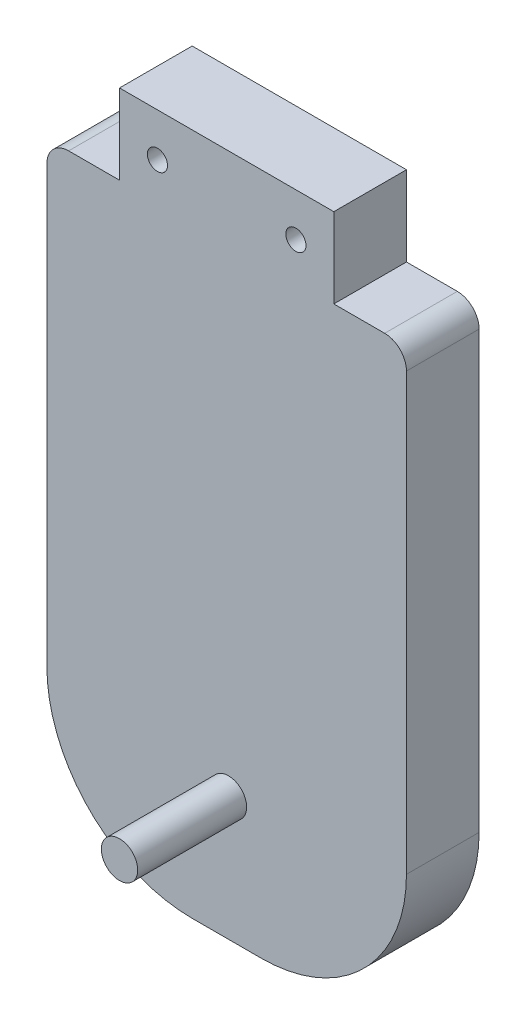
ISO-10303-21;
HEADER;
FILE_DESCRIPTION(('STEP AP214'),'2;1');
FILE_NAME('part.step','',(''),(''),'','','');
FILE_SCHEMA(('AUTOMOTIVE_DESIGN { 1 0 10303 214 1 1 1 1 }'));
ENDSEC;
DATA;
#1=APPLICATION_CONTEXT('core data for automotive mechanical design processes');
#2=APPLICATION_PROTOCOL_DEFINITION('international standard','automotive_design',2000,#1);
#3=PRODUCT_CONTEXT('',#1,'mechanical');
#4=PRODUCT('Part','Part','',(#3));
#5=PRODUCT_RELATED_PRODUCT_CATEGORY('part','',(#4));
#6=PRODUCT_DEFINITION_FORMATION('','',#4);
#7=PRODUCT_DEFINITION_CONTEXT('part definition',#1,'design');
#8=PRODUCT_DEFINITION('design','',#6,#7);
#9=PRODUCT_DEFINITION_SHAPE('','',#8);
#10=(LENGTH_UNIT() NAMED_UNIT(*) SI_UNIT(.MILLI.,.METRE.));
#11=(NAMED_UNIT(*) PLANE_ANGLE_UNIT() SI_UNIT($,.RADIAN.));
#12=(NAMED_UNIT(*) SI_UNIT($,.STERADIAN.) SOLID_ANGLE_UNIT());
#13=UNCERTAINTY_MEASURE_WITH_UNIT(LENGTH_MEASURE(1.E-05),#10,'distance_accuracy_value','');
#14=(GEOMETRIC_REPRESENTATION_CONTEXT(3) GLOBAL_UNCERTAINTY_ASSIGNED_CONTEXT((#13)) GLOBAL_UNIT_ASSIGNED_CONTEXT((#10,
#11,#12)) REPRESENTATION_CONTEXT('',''));
#15=CARTESIAN_POINT('',(0.,0.,0.));
#16=DIRECTION('',(0.,0.,1.));
#17=DIRECTION('',(1.,0.,0.));
#18=AXIS2_PLACEMENT_3D('',#15,#16,#17);
#19=CARTESIAN_POINT('',(11.5756722266574,78.1811812764466,0.));
#20=DIRECTION('',(-1.,0.,0.));
#21=DIRECTION('',(0.,-1.,0.));
#22=AXIS2_PLACEMENT_3D('',#19,#20,#21);
#23=PLANE('',#22);
#24=DIRECTION('',(0.,-1.,0.));
#25=VECTOR('',#24,1.);
#26=CARTESIAN_POINT('',(11.5756722266574,78.1811812764466,10.));
#27=LINE('',#26,#25);
#28=CARTESIAN_POINT('',(11.5756722266574,78.1811812764466,10.));
#29=VERTEX_POINT('',#28);
#30=CARTESIAN_POINT('',(11.5756722266574,67.1811812764466,10.));
#31=VERTEX_POINT('',#30);
#32=EDGE_CURVE('E168',#29,#31,#27,.T.);
#33=ORIENTED_EDGE('',*,*,#32,.F.);
#34=DIRECTION('',(0.,0.,1.));
#35=VECTOR('',#34,1.);
#36=CARTESIAN_POINT('',(11.5756722266574,78.1811812764466,0.));
#37=LINE('',#36,#35);
#38=CARTESIAN_POINT('',(11.5756722266574,78.1811812764466,0.));
#39=VERTEX_POINT('',#38);
#40=EDGE_CURVE('E11',#39,#29,#37,.T.);
#41=ORIENTED_EDGE('',*,*,#40,.F.);
#42=DIRECTION('',(0.,-1.,0.));
#43=VECTOR('',#42,1.);
#44=CARTESIAN_POINT('',(11.5756722266574,78.1811812764466,0.));
#45=LINE('',#44,#43);
#46=CARTESIAN_POINT('',(11.5756722266574,67.1811812764466,0.));
#47=VERTEX_POINT('',#46);
#48=EDGE_CURVE('E213',#39,#47,#45,.T.);
#49=ORIENTED_EDGE('',*,*,#48,.T.);
#50=DIRECTION('',(0.,0.,1.));
#51=VECTOR('',#50,1.);
#52=CARTESIAN_POINT('',(11.5756722266574,67.1811812764466,0.));
#53=LINE('',#52,#51);
#54=EDGE_CURVE('E44',#47,#31,#53,.T.);
#55=ORIENTED_EDGE('',*,*,#54,.T.);
#56=EDGE_LOOP('',(#33,#41,#49,#55));
#57=FACE_BOUND('',#56,.T.);
#58=ADVANCED_FACE('F41',(#57),#23,.T.);
#59=CARTESIAN_POINT('',(41.0756722266575,78.1811812764467,0.));
#60=DIRECTION('',(0.,1.,0.));
#61=DIRECTION('',(-1.,0.,0.));
#62=AXIS2_PLACEMENT_3D('',#59,#60,#61);
#63=PLANE('',#62);
#64=DIRECTION('',(-1.,0.,0.));
#65=VECTOR('',#64,1.);
#66=CARTESIAN_POINT('',(41.0756722266575,78.1811812764467,10.));
#67=LINE('',#66,#65);
#68=CARTESIAN_POINT('',(41.0756722266575,78.1811812764467,10.));
#69=VERTEX_POINT('',#68);
#70=EDGE_CURVE('E210',#69,#29,#67,.T.);
#71=ORIENTED_EDGE('',*,*,#70,.F.);
#72=DIRECTION('',(0.,0.,1.));
#73=VECTOR('',#72,1.);
#74=CARTESIAN_POINT('',(41.0756722266575,78.1811812764467,0.));
#75=LINE('',#74,#73);
#76=CARTESIAN_POINT('',(41.0756722266575,78.1811812764467,0.));
#77=VERTEX_POINT('',#76);
#78=EDGE_CURVE('E51',#77,#69,#75,.T.);
#79=ORIENTED_EDGE('',*,*,#78,.F.);
#80=DIRECTION('',(-1.,0.,0.));
#81=VECTOR('',#80,1.);
#82=CARTESIAN_POINT('',(41.0756722266575,78.1811812764467,0.));
#83=LINE('',#82,#81);
#84=EDGE_CURVE('E154',#77,#39,#83,.T.);
#85=ORIENTED_EDGE('',*,*,#84,.T.);
#86=ORIENTED_EDGE('',*,*,#40,.T.);
#87=EDGE_LOOP('',(#71,#79,#85,#86));
#88=FACE_BOUND('',#87,.T.);
#89=ADVANCED_FACE('F243',(#88),#63,.T.);
#90=CARTESIAN_POINT('',(41.0756722266574,67.1811812764467,0.));
#91=DIRECTION('',(1.,0.,0.));
#92=DIRECTION('',(0.,1.,0.));
#93=AXIS2_PLACEMENT_3D('',#90,#91,#92);
#94=PLANE('',#93);
#95=DIRECTION('',(0.,1.,0.));
#96=VECTOR('',#95,1.);
#97=CARTESIAN_POINT('',(41.0756722266574,67.1811812764467,10.));
#98=LINE('',#97,#96);
#99=CARTESIAN_POINT('',(41.0756722266574,67.1811812764467,10.));
#100=VERTEX_POINT('',#99);
#101=EDGE_CURVE('E140',#100,#69,#98,.T.);
#102=ORIENTED_EDGE('',*,*,#101,.F.);
#103=DIRECTION('',(0.,0.,1.));
#104=VECTOR('',#103,1.);
#105=CARTESIAN_POINT('',(41.0756722266574,67.1811812764467,0.));
#106=LINE('',#105,#104);
#107=CARTESIAN_POINT('',(41.0756722266574,67.1811812764467,0.));
#108=VERTEX_POINT('',#107);
#109=EDGE_CURVE('E135',#108,#100,#106,.T.);
#110=ORIENTED_EDGE('',*,*,#109,.F.);
#111=DIRECTION('',(0.,1.,0.));
#112=VECTOR('',#111,1.);
#113=CARTESIAN_POINT('',(41.0756722266574,67.1811812764467,0.));
#114=LINE('',#113,#112);
#115=EDGE_CURVE('E138',#108,#77,#114,.T.);
#116=ORIENTED_EDGE('',*,*,#115,.T.);
#117=ORIENTED_EDGE('',*,*,#78,.T.);
#118=EDGE_LOOP('',(#102,#110,#116,#117));
#119=FACE_BOUND('',#118,.T.);
#120=ADVANCED_FACE('F137',(#119),#94,.T.);
#121=CARTESIAN_POINT('',(48.0756722266574,67.1811812764467,0.));
#122=DIRECTION('',(0.,1.,0.));
#123=DIRECTION('',(0.,0.,1.));
#124=AXIS2_PLACEMENT_3D('',#121,#122,#123);
#125=PLANE('',#124);
#126=DIRECTION('',(-1.,0.,0.));
#127=VECTOR('',#126,1.);
#128=CARTESIAN_POINT('',(48.0756722266574,67.1811812764467,10.));
#129=LINE('',#128,#127);
#130=CARTESIAN_POINT('',(48.0756722266574,67.1811812764467,10.));
#131=VERTEX_POINT('',#130);
#132=EDGE_CURVE('E205',#131,#100,#129,.T.);
#133=ORIENTED_EDGE('',*,*,#132,.F.);
#134=DIRECTION('',(0.,0.,1.));
#135=VECTOR('',#134,1.);
#136=CARTESIAN_POINT('',(48.0756722266574,67.1811812764467,0.));
#137=LINE('',#136,#135);
#138=CARTESIAN_POINT('',(48.0756722266574,67.1811812764467,0.));
#139=VERTEX_POINT('',#138);
#140=EDGE_CURVE('E146',#139,#131,#137,.T.);
#141=ORIENTED_EDGE('',*,*,#140,.F.);
#142=DIRECTION('',(-1.,0.,0.));
#143=VECTOR('',#142,1.);
#144=CARTESIAN_POINT('',(48.0756722266574,67.1811812764467,0.));
#145=LINE('',#144,#143);
#146=EDGE_CURVE('E152',#139,#108,#145,.T.);
#147=ORIENTED_EDGE('',*,*,#146,.T.);
#148=ORIENTED_EDGE('',*,*,#109,.T.);
#149=EDGE_LOOP('',(#133,#141,#147,#148));
#150=FACE_BOUND('',#149,.T.);
#151=ADVANCED_FACE('F157',(#150),#125,.T.);
#152=CARTESIAN_POINT('',(48.0756722266574,64.1811812764466,0.));
#153=DIRECTION('',(0.,0.,1.));
#154=DIRECTION('',(1.,0.,0.));
#155=AXIS2_PLACEMENT_3D('',#152,#153,#154);
#156=CYLINDRICAL_SURFACE('',#155,3.00000000000003);
#157=CARTESIAN_POINT('',(48.0756722266574,64.1811812764466,10.));
#158=DIRECTION('',(0.,0.,1.));
#159=DIRECTION('',(1.,0.,0.));
#160=AXIS2_PLACEMENT_3D('',#157,#158,#159);
#161=CIRCLE('',#160,3.00000000000003);
#162=CARTESIAN_POINT('',(51.0756722266575,64.1811812764466,10.));
#163=VERTEX_POINT('',#162);
#164=EDGE_CURVE('E201',#163,#131,#161,.T.);
#165=ORIENTED_EDGE('',*,*,#164,.F.);
#166=DIRECTION('',(0.,0.,1.));
#167=VECTOR('',#166,1.);
#168=CARTESIAN_POINT('',(51.0756722266575,64.1811812764466,0.));
#169=LINE('',#168,#167);
#170=CARTESIAN_POINT('',(51.0756722266575,64.1811812764466,0.));
#171=VERTEX_POINT('',#170);
#172=EDGE_CURVE('E219',#171,#163,#169,.T.);
#173=ORIENTED_EDGE('',*,*,#172,.F.);
#174=CARTESIAN_POINT('',(48.0756722266574,64.1811812764466,0.));
#175=DIRECTION('',(0.,0.,1.));
#176=DIRECTION('',(1.,0.,0.));
#177=AXIS2_PLACEMENT_3D('',#174,#175,#176);
#178=CIRCLE('',#177,3.00000000000003);
#179=EDGE_CURVE('E159',#171,#139,#178,.T.);
#180=ORIENTED_EDGE('',*,*,#179,.T.);
#181=ORIENTED_EDGE('',*,*,#140,.T.);
#182=EDGE_LOOP('',(#165,#173,#180,#181));
#183=FACE_BOUND('',#182,.T.);
#184=ADVANCED_FACE('F256',(#183),#156,.T.);
#185=CARTESIAN_POINT('',(51.0756722266575,4.18118127644664,0.));
#186=DIRECTION('',(1.,0.,0.));
#187=DIRECTION('',(0.,0.,-1.));
#188=AXIS2_PLACEMENT_3D('',#185,#186,#187);
#189=PLANE('',#188);
#190=DIRECTION('',(0.,1.,0.));
#191=VECTOR('',#190,1.);
#192=CARTESIAN_POINT('',(51.0756722266575,4.18118127644664,10.));
#193=LINE('',#192,#191);
#194=CARTESIAN_POINT('',(51.0756722266575,4.18118127644664,10.));
#195=VERTEX_POINT('',#194);
#196=EDGE_CURVE('E197',#195,#163,#193,.T.);
#197=ORIENTED_EDGE('',*,*,#196,.F.);
#198=DIRECTION('',(0.,0.,1.));
#199=VECTOR('',#198,1.);
#200=CARTESIAN_POINT('',(51.0756722266575,4.18118127644664,0.));
#201=LINE('',#200,#199);
#202=CARTESIAN_POINT('',(51.0756722266575,4.18118127644664,0.));
#203=VERTEX_POINT('',#202);
#204=EDGE_CURVE('E222',#203,#195,#201,.T.);
#205=ORIENTED_EDGE('',*,*,#204,.F.);
#206=DIRECTION('',(0.,1.,0.));
#207=VECTOR('',#206,1.);
#208=CARTESIAN_POINT('',(51.0756722266575,4.18118127644664,0.));
#209=LINE('',#208,#207);
#210=EDGE_CURVE('E162',#203,#171,#209,.T.);
#211=ORIENTED_EDGE('',*,*,#210,.T.);
#212=ORIENTED_EDGE('',*,*,#172,.T.);
#213=EDGE_LOOP('',(#197,#205,#211,#212));
#214=FACE_BOUND('',#213,.T.);
#215=ADVANCED_FACE('F259',(#214),#189,.T.);
#216=CARTESIAN_POINT('',(31.0756722266575,4.18118127644664,0.));
#217=DIRECTION('',(0.,0.,1.));
#218=DIRECTION('',(1.,0.,0.));
#219=AXIS2_PLACEMENT_3D('',#216,#217,#218);
#220=CYLINDRICAL_SURFACE('',#219,20.);
#221=CARTESIAN_POINT('',(31.0756722266575,4.18118127644664,10.));
#222=DIRECTION('',(0.,0.,1.));
#223=DIRECTION('',(1.,0.,0.));
#224=AXIS2_PLACEMENT_3D('',#221,#222,#223);
#225=CIRCLE('',#224,20.);
#226=CARTESIAN_POINT('',(31.0756722266575,-15.8188187235534,10.));
#227=VERTEX_POINT('',#226);
#228=EDGE_CURVE('E193',#227,#195,#225,.T.);
#229=ORIENTED_EDGE('',*,*,#228,.F.);
#230=DIRECTION('',(0.,0.,1.));
#231=VECTOR('',#230,1.);
#232=CARTESIAN_POINT('',(31.0756722266575,-15.8188187235534,0.));
#233=LINE('',#232,#231);
#234=CARTESIAN_POINT('',(31.0756722266575,-15.8188187235534,0.));
#235=VERTEX_POINT('',#234);
#236=EDGE_CURVE('E225',#235,#227,#233,.T.);
#237=ORIENTED_EDGE('',*,*,#236,.F.);
#238=CARTESIAN_POINT('',(31.0756722266575,4.18118127644664,0.));
#239=DIRECTION('',(0.,0.,1.));
#240=DIRECTION('',(1.,0.,0.));
#241=AXIS2_PLACEMENT_3D('',#238,#239,#240);
#242=CIRCLE('',#241,20.);
#243=EDGE_CURVE('E357',#235,#203,#242,.T.);
#244=ORIENTED_EDGE('',*,*,#243,.T.);
#245=ORIENTED_EDGE('',*,*,#204,.T.);
#246=EDGE_LOOP('',(#229,#237,#244,#245));
#247=FACE_BOUND('',#246,.T.);
#248=ADVANCED_FACE('F263',(#247),#220,.T.);
#249=CARTESIAN_POINT('',(21.5756722266574,-15.8188187235534,0.));
#250=DIRECTION('',(0.,-1.,0.));
#251=DIRECTION('',(0.,0.,-1.));
#252=AXIS2_PLACEMENT_3D('',#249,#250,#251);
#253=PLANE('',#252);
#254=DIRECTION('',(1.,0.,0.));
#255=VECTOR('',#254,1.);
#256=CARTESIAN_POINT('',(21.5756722266574,-15.8188187235534,10.));
#257=LINE('',#256,#255);
#258=CARTESIAN_POINT('',(21.5756722266574,-15.8188187235534,10.));
#259=VERTEX_POINT('',#258);
#260=EDGE_CURVE('E189',#259,#227,#257,.T.);
#261=ORIENTED_EDGE('',*,*,#260,.F.);
#262=DIRECTION('',(0.,0.,1.));
#263=VECTOR('',#262,1.);
#264=CARTESIAN_POINT('',(21.5756722266574,-15.8188187235534,0.));
#265=LINE('',#264,#263);
#266=CARTESIAN_POINT('',(21.5756722266574,-15.8188187235534,0.));
#267=VERTEX_POINT('',#266);
#268=EDGE_CURVE('E228',#267,#259,#265,.T.);
#269=ORIENTED_EDGE('',*,*,#268,.F.);
#270=DIRECTION('',(1.,0.,0.));
#271=VECTOR('',#270,1.);
#272=CARTESIAN_POINT('',(21.5756722266574,-15.8188187235534,0.));
#273=LINE('',#272,#271);
#274=EDGE_CURVE('E353',#267,#235,#273,.T.);
#275=ORIENTED_EDGE('',*,*,#274,.T.);
#276=ORIENTED_EDGE('',*,*,#236,.T.);
#277=EDGE_LOOP('',(#261,#269,#275,#276));
#278=FACE_BOUND('',#277,.T.);
#279=ADVANCED_FACE('F267',(#278),#253,.T.);
#280=CARTESIAN_POINT('',(21.5756722266574,4.18118127644664,0.));
#281=DIRECTION('',(0.,0.,1.));
#282=DIRECTION('',(1.,0.,0.));
#283=AXIS2_PLACEMENT_3D('',#280,#281,#282);
#284=CYLINDRICAL_SURFACE('',#283,20.);
#285=CARTESIAN_POINT('',(21.5756722266574,4.18118127644664,10.));
#286=DIRECTION('',(0.,0.,1.));
#287=DIRECTION('',(1.,0.,0.));
#288=AXIS2_PLACEMENT_3D('',#285,#286,#287);
#289=CIRCLE('',#288,20.);
#290=CARTESIAN_POINT('',(1.57567222665744,4.18118127644663,10.));
#291=VERTEX_POINT('',#290);
#292=EDGE_CURVE('E185',#291,#259,#289,.T.);
#293=ORIENTED_EDGE('',*,*,#292,.F.);
#294=DIRECTION('',(0.,0.,1.));
#295=VECTOR('',#294,1.);
#296=CARTESIAN_POINT('',(1.57567222665744,4.18118127644663,0.));
#297=LINE('',#296,#295);
#298=CARTESIAN_POINT('',(1.57567222665744,4.18118127644663,0.));
#299=VERTEX_POINT('',#298);
#300=EDGE_CURVE('E231',#299,#291,#297,.T.);
#301=ORIENTED_EDGE('',*,*,#300,.F.);
#302=CARTESIAN_POINT('',(21.5756722266574,4.18118127644664,0.));
#303=DIRECTION('',(0.,0.,1.));
#304=DIRECTION('',(1.,0.,0.));
#305=AXIS2_PLACEMENT_3D('',#302,#303,#304);
#306=CIRCLE('',#305,20.);
#307=EDGE_CURVE('E349',#299,#267,#306,.T.);
#308=ORIENTED_EDGE('',*,*,#307,.T.);
#309=ORIENTED_EDGE('',*,*,#268,.T.);
#310=EDGE_LOOP('',(#293,#301,#308,#309));
#311=FACE_BOUND('',#310,.T.);
#312=ADVANCED_FACE('F271',(#311),#284,.T.);
#313=CARTESIAN_POINT('',(1.57567222665744,64.1811812764466,0.));
#314=DIRECTION('',(-1.,0.,0.));
#315=DIRECTION('',(0.,0.,1.));
#316=AXIS2_PLACEMENT_3D('',#313,#314,#315);
#317=PLANE('',#316);
#318=DIRECTION('',(0.,-1.,0.));
#319=VECTOR('',#318,1.);
#320=CARTESIAN_POINT('',(1.57567222665744,64.1811812764466,10.));
#321=LINE('',#320,#319);
#322=CARTESIAN_POINT('',(1.57567222665744,64.1811812764466,10.));
#323=VERTEX_POINT('',#322);
#324=EDGE_CURVE('E181',#323,#291,#321,.T.);
#325=ORIENTED_EDGE('',*,*,#324,.F.);
#326=DIRECTION('',(0.,0.,1.));
#327=VECTOR('',#326,1.);
#328=CARTESIAN_POINT('',(1.57567222665744,64.1811812764466,0.));
#329=LINE('',#328,#327);
#330=CARTESIAN_POINT('',(1.57567222665744,64.1811812764466,0.));
#331=VERTEX_POINT('',#330);
#332=EDGE_CURVE('E234',#331,#323,#329,.T.);
#333=ORIENTED_EDGE('',*,*,#332,.F.);
#334=DIRECTION('',(0.,-1.,0.));
#335=VECTOR('',#334,1.);
#336=CARTESIAN_POINT('',(1.57567222665744,64.1811812764466,0.));
#337=LINE('',#336,#335);
#338=EDGE_CURVE('E345',#331,#299,#337,.T.);
#339=ORIENTED_EDGE('',*,*,#338,.T.);
#340=ORIENTED_EDGE('',*,*,#300,.T.);
#341=EDGE_LOOP('',(#325,#333,#339,#340));
#342=FACE_BOUND('',#341,.T.);
#343=ADVANCED_FACE('F275',(#342),#317,.T.);
#344=CARTESIAN_POINT('',(4.57567222665745,64.1811812764466,0.));
#345=DIRECTION('',(0.,0.,1.));
#346=DIRECTION('',(1.,0.,0.));
#347=AXIS2_PLACEMENT_3D('',#344,#345,#346);
#348=CYLINDRICAL_SURFACE('',#347,3.);
#349=CARTESIAN_POINT('',(4.57567222665745,64.1811812764466,10.));
#350=DIRECTION('',(0.,0.,1.));
#351=DIRECTION('',(1.,0.,0.));
#352=AXIS2_PLACEMENT_3D('',#349,#350,#351);
#353=CIRCLE('',#352,3.);
#354=CARTESIAN_POINT('',(4.57567222665745,67.1811812764466,10.));
#355=VERTEX_POINT('',#354);
#356=EDGE_CURVE('E177',#355,#323,#353,.T.);
#357=ORIENTED_EDGE('',*,*,#356,.F.);
#358=DIRECTION('',(0.,0.,1.));
#359=VECTOR('',#358,1.);
#360=CARTESIAN_POINT('',(4.57567222665745,67.1811812764466,0.));
#361=LINE('',#360,#359);
#362=CARTESIAN_POINT('',(4.57567222665745,67.1811812764466,0.));
#363=VERTEX_POINT('',#362);
#364=EDGE_CURVE('E236',#363,#355,#361,.T.);
#365=ORIENTED_EDGE('',*,*,#364,.F.);
#366=CARTESIAN_POINT('',(4.57567222665745,64.1811812764466,0.));
#367=DIRECTION('',(0.,0.,1.));
#368=DIRECTION('',(1.,0.,0.));
#369=AXIS2_PLACEMENT_3D('',#366,#367,#368);
#370=CIRCLE('',#369,3.);
#371=EDGE_CURVE('E341',#363,#331,#370,.T.);
#372=ORIENTED_EDGE('',*,*,#371,.T.);
#373=ORIENTED_EDGE('',*,*,#332,.T.);
#374=EDGE_LOOP('',(#357,#365,#372,#373));
#375=FACE_BOUND('',#374,.T.);
#376=ADVANCED_FACE('F279',(#375),#348,.T.);
#377=CARTESIAN_POINT('',(11.5756722266574,67.1811812764466,0.));
#378=DIRECTION('',(0.,1.,0.));
#379=DIRECTION('',(0.,0.,1.));
#380=AXIS2_PLACEMENT_3D('',#377,#378,#379);
#381=PLANE('',#380);
#382=DIRECTION('',(-1.,0.,0.));
#383=VECTOR('',#382,1.);
#384=CARTESIAN_POINT('',(11.5756722266574,67.1811812764466,10.));
#385=LINE('',#384,#383);
#386=EDGE_CURVE('E172',#31,#355,#385,.T.);
#387=ORIENTED_EDGE('',*,*,#386,.F.);
#388=ORIENTED_EDGE('',*,*,#54,.F.);
#389=DIRECTION('',(-1.,0.,0.));
#390=VECTOR('',#389,1.);
#391=CARTESIAN_POINT('',(11.5756722266574,67.1811812764466,0.));
#392=LINE('',#391,#390);
#393=EDGE_CURVE('E338',#47,#363,#392,.T.);
#394=ORIENTED_EDGE('',*,*,#393,.T.);
#395=ORIENTED_EDGE('',*,*,#364,.T.);
#396=EDGE_LOOP('',(#387,#388,#394,#395));
#397=FACE_BOUND('',#396,.T.);
#398=ADVANCED_FACE('F240',(#397),#381,.T.);
#399=CARTESIAN_POINT('',(4.57567222665745,64.1811812764466,0.));
#400=DIRECTION('',(0.,0.,1.));
#401=DIRECTION('',(1.,0.,0.));
#402=AXIS2_PLACEMENT_3D('',#399,#400,#401);
#403=PLANE('',#402);
#404=CARTESIAN_POINT('',(35.8534500044352,72.2222222222222,0.));
#405=DIRECTION('',(0.,0.,1.));
#406=DIRECTION('',(-1.,0.,0.));
#407=AXIS2_PLACEMENT_3D('',#404,#405,#406);
#408=CIRCLE('',#407,1.38888888888889);
#409=CARTESIAN_POINT('',(34.4645611155463,72.2222222222222,0.));
#410=VERTEX_POINT('',#409);
#411=EDGE_CURVE('E322',#410,#410,#408,.T.);
#412=ORIENTED_EDGE('',*,*,#411,.T.);
#413=EDGE_LOOP('',(#412));
#414=FACE_BOUND('',#413,.T.);
#415=CARTESIAN_POINT('',(16.7956722266574,72.2222222222222,0.));
#416=DIRECTION('',(0.,0.,1.));
#417=DIRECTION('',(-1.,0.,0.));
#418=AXIS2_PLACEMENT_3D('',#415,#416,#417);
#419=CIRCLE('',#418,1.38888888888888);
#420=CARTESIAN_POINT('',(15.4067833377686,72.2222222222222,0.));
#421=VERTEX_POINT('',#420);
#422=EDGE_CURVE('E173',#421,#421,#419,.T.);
#423=ORIENTED_EDGE('',*,*,#422,.T.);
#424=EDGE_LOOP('',(#423));
#425=FACE_BOUND('',#424,.T.);
#426=ORIENTED_EDGE('',*,*,#48,.F.);
#427=ORIENTED_EDGE('',*,*,#84,.F.);
#428=ORIENTED_EDGE('',*,*,#115,.F.);
#429=ORIENTED_EDGE('',*,*,#146,.F.);
#430=ORIENTED_EDGE('',*,*,#179,.F.);
#431=ORIENTED_EDGE('',*,*,#210,.F.);
#432=ORIENTED_EDGE('',*,*,#243,.F.);
#433=ORIENTED_EDGE('',*,*,#274,.F.);
#434=ORIENTED_EDGE('',*,*,#307,.F.);
#435=ORIENTED_EDGE('',*,*,#338,.F.);
#436=ORIENTED_EDGE('',*,*,#371,.F.);
#437=ORIENTED_EDGE('',*,*,#393,.F.);
#438=EDGE_LOOP('',(#426,#427,#428,#429,#430,#431,#432,#433,#434,#435,#436,#437));
#439=FACE_BOUND('',#438,.T.);
#440=ADVANCED_FACE('F150',(#414,#425,#439),#403,.F.);
#441=CARTESIAN_POINT('',(4.57567222665745,64.1811812764466,10.));
#442=DIRECTION('',(0.,0.,1.));
#443=DIRECTION('',(1.,0.,0.));
#444=AXIS2_PLACEMENT_3D('',#441,#442,#443);
#445=PLANE('',#444);
#446=CARTESIAN_POINT('',(26.5756722266581,1.1811812764452,10.));
#447=DIRECTION('',(0.,0.,1.));
#448=DIRECTION('',(1.,0.,0.));
#449=AXIS2_PLACEMENT_3D('',#446,#447,#448);
#450=CIRCLE('',#449,2.5);
#451=CARTESIAN_POINT('',(29.0756722266581,1.1811812764452,10.));
#452=VERTEX_POINT('',#451);
#453=EDGE_CURVE('E317',#452,#452,#450,.T.);
#454=ORIENTED_EDGE('',*,*,#453,.F.);
#455=EDGE_LOOP('',(#454));
#456=FACE_BOUND('',#455,.T.);
#457=CARTESIAN_POINT('',(35.8534500044352,72.2222222222222,10.));
#458=DIRECTION('',(0.,0.,1.));
#459=DIRECTION('',(-1.,0.,0.));
#460=AXIS2_PLACEMENT_3D('',#457,#458,#459);
#461=CIRCLE('',#460,1.38888888888889);
#462=CARTESIAN_POINT('',(34.4645611155463,72.2222222222222,10.));
#463=VERTEX_POINT('',#462);
#464=EDGE_CURVE('E316',#463,#463,#461,.T.);
#465=ORIENTED_EDGE('',*,*,#464,.F.);
#466=EDGE_LOOP('',(#465));
#467=FACE_BOUND('',#466,.T.);
#468=CARTESIAN_POINT('',(16.7956722266574,72.2222222222222,10.));
#469=DIRECTION('',(0.,0.,1.));
#470=DIRECTION('',(-1.,0.,0.));
#471=AXIS2_PLACEMENT_3D('',#468,#469,#470);
#472=CIRCLE('',#471,1.38888888888888);
#473=CARTESIAN_POINT('',(15.4067833377686,72.2222222222222,10.));
#474=VERTEX_POINT('',#473);
#475=EDGE_CURVE('E328',#474,#474,#472,.T.);
#476=ORIENTED_EDGE('',*,*,#475,.F.);
#477=EDGE_LOOP('',(#476));
#478=FACE_BOUND('',#477,.T.);
#479=ORIENTED_EDGE('',*,*,#32,.T.);
#480=ORIENTED_EDGE('',*,*,#386,.T.);
#481=ORIENTED_EDGE('',*,*,#356,.T.);
#482=ORIENTED_EDGE('',*,*,#324,.T.);
#483=ORIENTED_EDGE('',*,*,#292,.T.);
#484=ORIENTED_EDGE('',*,*,#260,.T.);
#485=ORIENTED_EDGE('',*,*,#228,.T.);
#486=ORIENTED_EDGE('',*,*,#196,.T.);
#487=ORIENTED_EDGE('',*,*,#164,.T.);
#488=ORIENTED_EDGE('',*,*,#132,.T.);
#489=ORIENTED_EDGE('',*,*,#101,.T.);
#490=ORIENTED_EDGE('',*,*,#70,.T.);
#491=EDGE_LOOP('',(#479,#480,#481,#482,#483,#484,#485,#486,#487,#488,#489,#490));
#492=FACE_BOUND('',#491,.T.);
#493=ADVANCED_FACE('F242',(#456,#467,#478,#492),#445,.T.);
#494=CARTESIAN_POINT('',(16.7956722266574,72.2222222222222,0.));
#495=DIRECTION('',(0.,0.,1.));
#496=DIRECTION('',(1.,0.,0.));
#497=AXIS2_PLACEMENT_3D('',#494,#495,#496);
#498=CYLINDRICAL_SURFACE('',#497,1.38888888888888);
#499=ORIENTED_EDGE('',*,*,#422,.F.);
#500=EDGE_LOOP('',(#499));
#501=FACE_BOUND('',#500,.T.);
#502=ORIENTED_EDGE('',*,*,#475,.T.);
#503=EDGE_LOOP('',(#502));
#504=FACE_BOUND('',#503,.T.);
#505=ADVANCED_FACE('F291',(#501,#504),#498,.F.);
#506=CARTESIAN_POINT('',(35.8534500044352,72.2222222222222,0.));
#507=DIRECTION('',(0.,0.,1.));
#508=DIRECTION('',(1.,0.,0.));
#509=AXIS2_PLACEMENT_3D('',#506,#507,#508);
#510=CYLINDRICAL_SURFACE('',#509,1.38888888888889);
#511=ORIENTED_EDGE('',*,*,#411,.F.);
#512=EDGE_LOOP('',(#511));
#513=FACE_BOUND('',#512,.T.);
#514=ORIENTED_EDGE('',*,*,#464,.T.);
#515=EDGE_LOOP('',(#514));
#516=FACE_BOUND('',#515,.T.);
#517=ADVANCED_FACE('F298',(#513,#516),#510,.F.);
#518=CARTESIAN_POINT('',(26.5756722266581,1.1811812764452,25.));
#519=DIRECTION('',(0.,0.,-1.));
#520=DIRECTION('',(-1.,0.,0.));
#521=AXIS2_PLACEMENT_3D('',#518,#519,#520);
#522=CYLINDRICAL_SURFACE('',#521,2.5);
#523=CARTESIAN_POINT('',(26.5756722266581,1.1811812764452,25.));
#524=DIRECTION('',(0.,0.,1.));
#525=DIRECTION('',(1.,0.,0.));
#526=AXIS2_PLACEMENT_3D('',#523,#524,#525);
#527=CIRCLE('',#526,2.5);
#528=CARTESIAN_POINT('',(29.0756722266581,1.1811812764452,25.));
#529=VERTEX_POINT('',#528);
#530=EDGE_CURVE('E314',#529,#529,#527,.T.);
#531=ORIENTED_EDGE('',*,*,#530,.F.);
#532=EDGE_LOOP('',(#531));
#533=FACE_BOUND('',#532,.T.);
#534=ORIENTED_EDGE('',*,*,#453,.T.);
#535=EDGE_LOOP('',(#534));
#536=FACE_BOUND('',#535,.T.);
#537=ADVANCED_FACE('F302',(#533,#536),#522,.T.);
#538=CARTESIAN_POINT('',(26.5756722266581,1.1811812764452,25.));
#539=DIRECTION('',(0.,0.,1.));
#540=DIRECTION('',(1.,0.,0.));
#541=AXIS2_PLACEMENT_3D('',#538,#539,#540);
#542=PLANE('',#541);
#543=ORIENTED_EDGE('',*,*,#530,.T.);
#544=EDGE_LOOP('',(#543));
#545=FACE_BOUND('',#544,.T.);
#546=ADVANCED_FACE('F306',(#545),#542,.T.);
#547=CLOSED_SHELL('',(#58,#89,#120,#151,#184,#215,#248,#279,#312,#343,#376,#398,#440,#493,#505,
#517,#537,#546));
#548=MANIFOLD_SOLID_BREP('B2',#547);
#549=ADVANCED_BREP_SHAPE_REPRESENTATION('',(#18,#548),#14);
#550=SHAPE_DEFINITION_REPRESENTATION(#9,#549);
ENDSEC;
END-ISO-10303-21;
